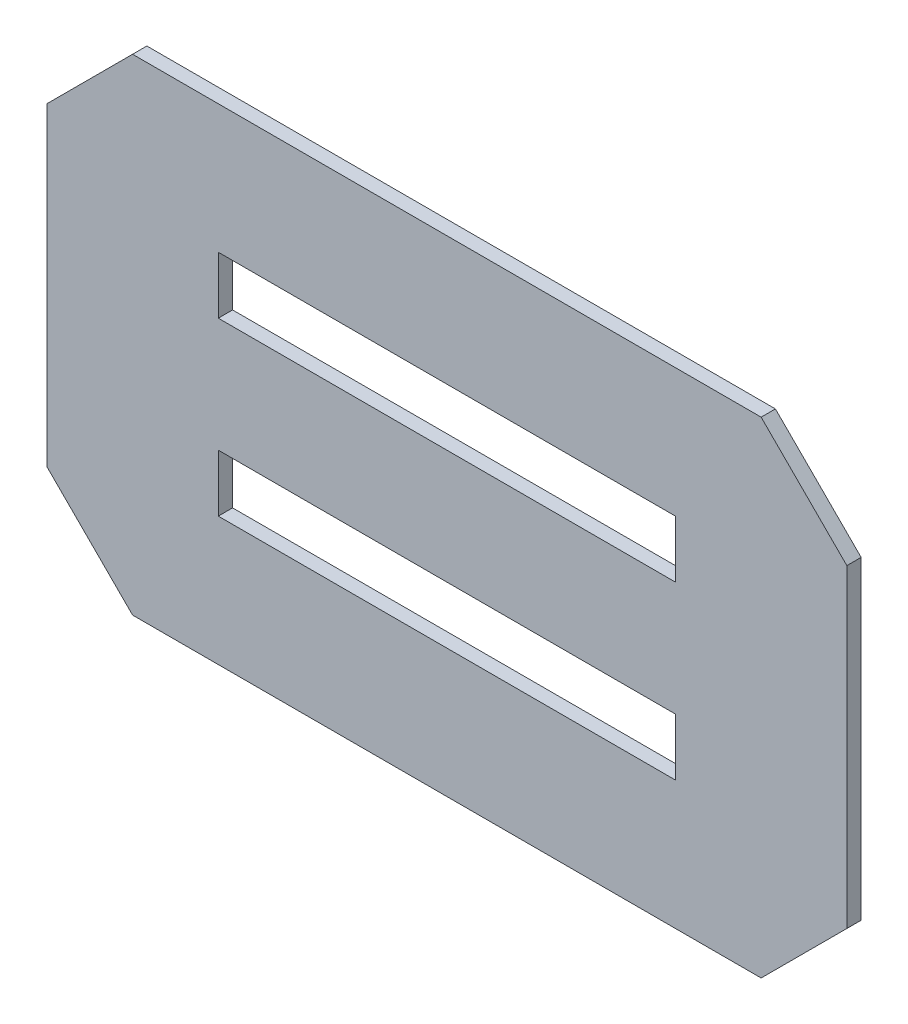
ISO-10303-21;
HEADER;
FILE_DESCRIPTION(('STEP AP214'),'2;1');
FILE_NAME('part.step','',(''),(''),'','','');
FILE_SCHEMA(('AUTOMOTIVE_DESIGN { 1 0 10303 214 1 1 1 1 }'));
ENDSEC;
DATA;
#1=APPLICATION_CONTEXT('core data for automotive mechanical design processes');
#2=APPLICATION_PROTOCOL_DEFINITION('international standard','automotive_design',2000,#1);
#3=PRODUCT_CONTEXT('',#1,'mechanical');
#4=PRODUCT('Part','Part','',(#3));
#5=PRODUCT_RELATED_PRODUCT_CATEGORY('part','',(#4));
#6=PRODUCT_DEFINITION_FORMATION('','',#4);
#7=PRODUCT_DEFINITION_CONTEXT('part definition',#1,'design');
#8=PRODUCT_DEFINITION('design','',#6,#7);
#9=PRODUCT_DEFINITION_SHAPE('','',#8);
#10=(LENGTH_UNIT() NAMED_UNIT(*) SI_UNIT(.MILLI.,.METRE.));
#11=(NAMED_UNIT(*) PLANE_ANGLE_UNIT() SI_UNIT($,.RADIAN.));
#12=(NAMED_UNIT(*) SI_UNIT($,.STERADIAN.) SOLID_ANGLE_UNIT());
#13=UNCERTAINTY_MEASURE_WITH_UNIT(LENGTH_MEASURE(1.E-05),#10,'distance_accuracy_value','');
#14=(GEOMETRIC_REPRESENTATION_CONTEXT(3) GLOBAL_UNCERTAINTY_ASSIGNED_CONTEXT((#13)) GLOBAL_UNIT_ASSIGNED_CONTEXT((#10,
#11,#12)) REPRESENTATION_CONTEXT('',''));
#15=CARTESIAN_POINT('',(0.,0.,0.));
#16=DIRECTION('',(0.,0.,1.));
#17=DIRECTION('',(1.,0.,0.));
#18=AXIS2_PLACEMENT_3D('',#15,#16,#17);
#19=CARTESIAN_POINT('',(0.,0.,0.5));
#20=DIRECTION('',(0.,0.,-1.));
#21=DIRECTION('',(-1.,0.,0.));
#22=AXIS2_PLACEMENT_3D('',#19,#20,#21);
#23=PLANE('',#22);
#24=DIRECTION('',(0.,-1.,0.));
#25=VECTOR('',#24,1.);
#26=CARTESIAN_POINT('',(-8.,-4.,0.5));
#27=LINE('',#26,#25);
#28=CARTESIAN_POINT('',(-8.,-2.,0.5));
#29=VERTEX_POINT('',#28);
#30=CARTESIAN_POINT('',(-8.,-4.,0.5));
#31=VERTEX_POINT('',#30);
#32=EDGE_CURVE('E190',#29,#31,#27,.T.);
#33=ORIENTED_EDGE('',*,*,#32,.F.);
#34=DIRECTION('',(-1.,0.,0.));
#35=VECTOR('',#34,1.);
#36=CARTESIAN_POINT('',(-8.,-2.,0.5));
#37=LINE('',#36,#35);
#38=CARTESIAN_POINT('',(8.,-2.,0.5));
#39=VERTEX_POINT('',#38);
#40=EDGE_CURVE('E198',#39,#29,#37,.T.);
#41=ORIENTED_EDGE('',*,*,#40,.F.);
#42=DIRECTION('',(0.,1.,0.));
#43=VECTOR('',#42,1.);
#44=CARTESIAN_POINT('',(8.,-4.,0.5));
#45=LINE('',#44,#43);
#46=CARTESIAN_POINT('',(8.,-4.,0.5));
#47=VERTEX_POINT('',#46);
#48=EDGE_CURVE('E195',#47,#39,#45,.T.);
#49=ORIENTED_EDGE('',*,*,#48,.F.);
#50=DIRECTION('',(1.,0.,0.));
#51=VECTOR('',#50,1.);
#52=CARTESIAN_POINT('',(-8.,-4.,0.5));
#53=LINE('',#52,#51);
#54=EDGE_CURVE('E192',#31,#47,#53,.T.);
#55=ORIENTED_EDGE('',*,*,#54,.F.);
#56=EDGE_LOOP('',(#33,#41,#49,#55));
#57=FACE_BOUND('',#56,.T.);
#58=DIRECTION('',(-1.,0.,0.));
#59=VECTOR('',#58,1.);
#60=CARTESIAN_POINT('',(-11.,8.5,0.5));
#61=LINE('',#60,#59);
#62=CARTESIAN_POINT('',(11.,8.5,0.5));
#63=VERTEX_POINT('',#62);
#64=CARTESIAN_POINT('',(-11.,8.5,0.5));
#65=VERTEX_POINT('',#64);
#66=EDGE_CURVE('E221',#63,#65,#61,.T.);
#67=ORIENTED_EDGE('',*,*,#66,.T.);
#68=DIRECTION('',(-0.707106781186548,-0.707106781186547,0.));
#69=VECTOR('',#68,1.);
#70=CARTESIAN_POINT('',(-14.,5.5,0.5));
#71=LINE('',#70,#69);
#72=CARTESIAN_POINT('',(-14.,5.5,0.5));
#73=VERTEX_POINT('',#72);
#74=EDGE_CURVE('E224',#65,#73,#71,.T.);
#75=ORIENTED_EDGE('',*,*,#74,.T.);
#76=DIRECTION('',(0.,-1.,0.));
#77=VECTOR('',#76,1.);
#78=CARTESIAN_POINT('',(-14.,5.5,0.5));
#79=LINE('',#78,#77);
#80=CARTESIAN_POINT('',(-14.,-5.5,0.5));
#81=VERTEX_POINT('',#80);
#82=EDGE_CURVE('E227',#73,#81,#79,.T.);
#83=ORIENTED_EDGE('',*,*,#82,.T.);
#84=DIRECTION('',(0.707106781186547,-0.707106781186548,0.));
#85=VECTOR('',#84,1.);
#86=CARTESIAN_POINT('',(-14.,-5.5,0.5));
#87=LINE('',#86,#85);
#88=CARTESIAN_POINT('',(-11.,-8.5,0.5));
#89=VERTEX_POINT('',#88);
#90=EDGE_CURVE('E229',#81,#89,#87,.T.);
#91=ORIENTED_EDGE('',*,*,#90,.T.);
#92=DIRECTION('',(1.,0.,0.));
#93=VECTOR('',#92,1.);
#94=CARTESIAN_POINT('',(-11.,-8.5,0.5));
#95=LINE('',#94,#93);
#96=CARTESIAN_POINT('',(11.,-8.5,0.5));
#97=VERTEX_POINT('',#96);
#98=EDGE_CURVE('E231',#89,#97,#95,.T.);
#99=ORIENTED_EDGE('',*,*,#98,.T.);
#100=DIRECTION('',(0.707106781186548,0.707106781186547,0.));
#101=VECTOR('',#100,1.);
#102=CARTESIAN_POINT('',(11.,-8.5,0.5));
#103=LINE('',#102,#101);
#104=CARTESIAN_POINT('',(14.,-5.5,0.5));
#105=VERTEX_POINT('',#104);
#106=EDGE_CURVE('E233',#97,#105,#103,.T.);
#107=ORIENTED_EDGE('',*,*,#106,.T.);
#108=DIRECTION('',(0.,1.,0.));
#109=VECTOR('',#108,1.);
#110=CARTESIAN_POINT('',(14.,5.5,0.5));
#111=LINE('',#110,#109);
#112=CARTESIAN_POINT('',(14.,5.5,0.5));
#113=VERTEX_POINT('',#112);
#114=EDGE_CURVE('E235',#105,#113,#111,.T.);
#115=ORIENTED_EDGE('',*,*,#114,.T.);
#116=DIRECTION('',(-0.707106781186548,0.707106781186547,0.));
#117=VECTOR('',#116,1.);
#118=CARTESIAN_POINT('',(11.,8.5,0.5));
#119=LINE('',#118,#117);
#120=EDGE_CURVE('E237',#113,#63,#119,.T.);
#121=ORIENTED_EDGE('',*,*,#120,.T.);
#122=EDGE_LOOP('',(#67,#75,#83,#91,#99,#107,#115,#121));
#123=FACE_BOUND('',#122,.T.);
#124=DIRECTION('',(0.,1.,0.));
#125=VECTOR('',#124,1.);
#126=CARTESIAN_POINT('',(8.,4.,0.5));
#127=LINE('',#126,#125);
#128=CARTESIAN_POINT('',(8.,2.,0.5));
#129=VERTEX_POINT('',#128);
#130=CARTESIAN_POINT('',(8.,4.,0.5));
#131=VERTEX_POINT('',#130);
#132=EDGE_CURVE('E154',#129,#131,#127,.T.);
#133=ORIENTED_EDGE('',*,*,#132,.F.);
#134=DIRECTION('',(1.,0.,0.));
#135=VECTOR('',#134,1.);
#136=CARTESIAN_POINT('',(-8.,2.,0.5));
#137=LINE('',#136,#135);
#138=CARTESIAN_POINT('',(-8.,2.,0.5));
#139=VERTEX_POINT('',#138);
#140=EDGE_CURVE('E176',#139,#129,#137,.T.);
#141=ORIENTED_EDGE('',*,*,#140,.F.);
#142=DIRECTION('',(0.,-1.,0.));
#143=VECTOR('',#142,1.);
#144=CARTESIAN_POINT('',(-8.,4.,0.5));
#145=LINE('',#144,#143);
#146=CARTESIAN_POINT('',(-8.,4.,0.5));
#147=VERTEX_POINT('',#146);
#148=EDGE_CURVE('E174',#147,#139,#145,.T.);
#149=ORIENTED_EDGE('',*,*,#148,.F.);
#150=DIRECTION('',(-1.,0.,0.));
#151=VECTOR('',#150,1.);
#152=CARTESIAN_POINT('',(-8.,4.,0.5));
#153=LINE('',#152,#151);
#154=EDGE_CURVE('E162',#131,#147,#153,.T.);
#155=ORIENTED_EDGE('',*,*,#154,.F.);
#156=EDGE_LOOP('',(#133,#141,#149,#155));
#157=FACE_BOUND('',#156,.T.);
#158=ADVANCED_FACE('F41',(#57,#123,#157),#23,.F.);
#159=CARTESIAN_POINT('',(0.,0.,0.));
#160=DIRECTION('',(0.,0.,-1.));
#161=DIRECTION('',(-1.,0.,0.));
#162=AXIS2_PLACEMENT_3D('',#159,#160,#161);
#163=PLANE('',#162);
#164=DIRECTION('',(-1.,0.,0.));
#165=VECTOR('',#164,1.);
#166=CARTESIAN_POINT('',(-11.,8.5,0.));
#167=LINE('',#166,#165);
#168=CARTESIAN_POINT('',(11.,8.5,0.));
#169=VERTEX_POINT('',#168);
#170=CARTESIAN_POINT('',(-11.,8.5,0.));
#171=VERTEX_POINT('',#170);
#172=EDGE_CURVE('E220',#169,#171,#167,.T.);
#173=ORIENTED_EDGE('',*,*,#172,.F.);
#174=DIRECTION('',(-0.707106781186548,0.707106781186547,0.));
#175=VECTOR('',#174,1.);
#176=CARTESIAN_POINT('',(11.,8.5,0.));
#177=LINE('',#176,#175);
#178=CARTESIAN_POINT('',(14.,5.5,0.));
#179=VERTEX_POINT('',#178);
#180=EDGE_CURVE('E225',#179,#169,#177,.T.);
#181=ORIENTED_EDGE('',*,*,#180,.F.);
#182=DIRECTION('',(0.,1.,0.));
#183=VECTOR('',#182,1.);
#184=CARTESIAN_POINT('',(14.,5.5,0.));
#185=LINE('',#184,#183);
#186=CARTESIAN_POINT('',(14.,-5.5,0.));
#187=VERTEX_POINT('',#186);
#188=EDGE_CURVE('E252',#187,#179,#185,.T.);
#189=ORIENTED_EDGE('',*,*,#188,.F.);
#190=DIRECTION('',(0.707106781186548,0.707106781186547,0.));
#191=VECTOR('',#190,1.);
#192=CARTESIAN_POINT('',(11.,-8.5,0.));
#193=LINE('',#192,#191);
#194=CARTESIAN_POINT('',(11.,-8.5,0.));
#195=VERTEX_POINT('',#194);
#196=EDGE_CURVE('E250',#195,#187,#193,.T.);
#197=ORIENTED_EDGE('',*,*,#196,.F.);
#198=DIRECTION('',(1.,0.,0.));
#199=VECTOR('',#198,1.);
#200=CARTESIAN_POINT('',(-11.,-8.5,0.));
#201=LINE('',#200,#199);
#202=CARTESIAN_POINT('',(-11.,-8.5,0.));
#203=VERTEX_POINT('',#202);
#204=EDGE_CURVE('E248',#203,#195,#201,.T.);
#205=ORIENTED_EDGE('',*,*,#204,.F.);
#206=DIRECTION('',(0.707106781186547,-0.707106781186548,0.));
#207=VECTOR('',#206,1.);
#208=CARTESIAN_POINT('',(-14.,-5.5,0.));
#209=LINE('',#208,#207);
#210=CARTESIAN_POINT('',(-14.,-5.5,0.));
#211=VERTEX_POINT('',#210);
#212=EDGE_CURVE('E246',#211,#203,#209,.T.);
#213=ORIENTED_EDGE('',*,*,#212,.F.);
#214=DIRECTION('',(0.,-1.,0.));
#215=VECTOR('',#214,1.);
#216=CARTESIAN_POINT('',(-14.,5.5,0.));
#217=LINE('',#216,#215);
#218=CARTESIAN_POINT('',(-14.,5.5,0.));
#219=VERTEX_POINT('',#218);
#220=EDGE_CURVE('E244',#219,#211,#217,.T.);
#221=ORIENTED_EDGE('',*,*,#220,.F.);
#222=DIRECTION('',(-0.707106781186548,-0.707106781186547,0.));
#223=VECTOR('',#222,1.);
#224=CARTESIAN_POINT('',(-14.,5.5,0.));
#225=LINE('',#224,#223);
#226=EDGE_CURVE('E242',#171,#219,#225,.T.);
#227=ORIENTED_EDGE('',*,*,#226,.F.);
#228=EDGE_LOOP('',(#173,#181,#189,#197,#205,#213,#221,#227));
#229=FACE_BOUND('',#228,.T.);
#230=DIRECTION('',(-1.,0.,0.));
#231=VECTOR('',#230,1.);
#232=CARTESIAN_POINT('',(-8.,-2.,0.));
#233=LINE('',#232,#231);
#234=CARTESIAN_POINT('',(8.,-2.,0.));
#235=VERTEX_POINT('',#234);
#236=CARTESIAN_POINT('',(-8.,-2.,0.));
#237=VERTEX_POINT('',#236);
#238=EDGE_CURVE('E193',#235,#237,#233,.T.);
#239=ORIENTED_EDGE('',*,*,#238,.T.);
#240=DIRECTION('',(0.,-1.,0.));
#241=VECTOR('',#240,1.);
#242=CARTESIAN_POINT('',(-8.,-4.,0.));
#243=LINE('',#242,#241);
#244=CARTESIAN_POINT('',(-8.,-4.,0.));
#245=VERTEX_POINT('',#244);
#246=EDGE_CURVE('E170',#237,#245,#243,.T.);
#247=ORIENTED_EDGE('',*,*,#246,.T.);
#248=DIRECTION('',(1.,0.,0.));
#249=VECTOR('',#248,1.);
#250=CARTESIAN_POINT('',(-8.,-4.,0.));
#251=LINE('',#250,#249);
#252=CARTESIAN_POINT('',(8.,-4.,0.));
#253=VERTEX_POINT('',#252);
#254=EDGE_CURVE('E203',#245,#253,#251,.T.);
#255=ORIENTED_EDGE('',*,*,#254,.T.);
#256=DIRECTION('',(0.,1.,0.));
#257=VECTOR('',#256,1.);
#258=CARTESIAN_POINT('',(8.,-4.,0.));
#259=LINE('',#258,#257);
#260=EDGE_CURVE('E206',#253,#235,#259,.T.);
#261=ORIENTED_EDGE('',*,*,#260,.T.);
#262=EDGE_LOOP('',(#239,#247,#255,#261));
#263=FACE_BOUND('',#262,.T.);
#264=DIRECTION('',(1.,0.,0.));
#265=VECTOR('',#264,1.);
#266=CARTESIAN_POINT('',(-8.,2.,0.));
#267=LINE('',#266,#265);
#268=CARTESIAN_POINT('',(-8.,2.,0.));
#269=VERTEX_POINT('',#268);
#270=CARTESIAN_POINT('',(8.,2.,0.));
#271=VERTEX_POINT('',#270);
#272=EDGE_CURVE('E163',#269,#271,#267,.T.);
#273=ORIENTED_EDGE('',*,*,#272,.T.);
#274=DIRECTION('',(0.,1.,0.));
#275=VECTOR('',#274,1.);
#276=CARTESIAN_POINT('',(8.,4.,0.));
#277=LINE('',#276,#275);
#278=CARTESIAN_POINT('',(8.,4.,0.));
#279=VERTEX_POINT('',#278);
#280=EDGE_CURVE('E64',#271,#279,#277,.T.);
#281=ORIENTED_EDGE('',*,*,#280,.T.);
#282=DIRECTION('',(-1.,0.,0.));
#283=VECTOR('',#282,1.);
#284=CARTESIAN_POINT('',(-8.,4.,0.));
#285=LINE('',#284,#283);
#286=CARTESIAN_POINT('',(-8.,4.,0.));
#287=VERTEX_POINT('',#286);
#288=EDGE_CURVE('E169',#279,#287,#285,.T.);
#289=ORIENTED_EDGE('',*,*,#288,.T.);
#290=DIRECTION('',(0.,-1.,0.));
#291=VECTOR('',#290,1.);
#292=CARTESIAN_POINT('',(-8.,4.,0.));
#293=LINE('',#292,#291);
#294=EDGE_CURVE('E182',#287,#269,#293,.T.);
#295=ORIENTED_EDGE('',*,*,#294,.T.);
#296=EDGE_LOOP('',(#273,#281,#289,#295));
#297=FACE_BOUND('',#296,.T.);
#298=ADVANCED_FACE('F282',(#229,#263,#297),#163,.T.);
#299=CARTESIAN_POINT('',(-11.,8.5,0.5));
#300=DIRECTION('',(0.,-1.,0.));
#301=DIRECTION('',(0.,0.,-1.));
#302=AXIS2_PLACEMENT_3D('',#299,#300,#301);
#303=PLANE('',#302);
#304=ORIENTED_EDGE('',*,*,#172,.T.);
#305=DIRECTION('',(0.,0.,-1.));
#306=VECTOR('',#305,1.);
#307=CARTESIAN_POINT('',(-11.,8.5,0.5));
#308=LINE('',#307,#306);
#309=EDGE_CURVE('E11',#65,#171,#308,.T.);
#310=ORIENTED_EDGE('',*,*,#309,.F.);
#311=ORIENTED_EDGE('',*,*,#66,.F.);
#312=DIRECTION('',(0.,0.,-1.));
#313=VECTOR('',#312,1.);
#314=CARTESIAN_POINT('',(11.,8.5,0.5));
#315=LINE('',#314,#313);
#316=EDGE_CURVE('E239',#63,#169,#315,.T.);
#317=ORIENTED_EDGE('',*,*,#316,.T.);
#318=EDGE_LOOP('',(#304,#310,#311,#317));
#319=FACE_BOUND('',#318,.T.);
#320=ADVANCED_FACE('F43',(#319),#303,.F.);
#321=CARTESIAN_POINT('',(-14.,5.5,0.5));
#322=DIRECTION('',(0.707106781186547,-0.707106781186548,0.));
#323=DIRECTION('',(0.707106781186548,0.707106781186547,0.));
#324=AXIS2_PLACEMENT_3D('',#321,#322,#323);
#325=PLANE('',#324);
#326=ORIENTED_EDGE('',*,*,#226,.T.);
#327=DIRECTION('',(0.,0.,-1.));
#328=VECTOR('',#327,1.);
#329=CARTESIAN_POINT('',(-14.,5.5,0.5));
#330=LINE('',#329,#328);
#331=EDGE_CURVE('E49',#73,#219,#330,.T.);
#332=ORIENTED_EDGE('',*,*,#331,.F.);
#333=ORIENTED_EDGE('',*,*,#74,.F.);
#334=ORIENTED_EDGE('',*,*,#309,.T.);
#335=EDGE_LOOP('',(#326,#332,#333,#334));
#336=FACE_BOUND('',#335,.T.);
#337=ADVANCED_FACE('F299',(#336),#325,.F.);
#338=CARTESIAN_POINT('',(-14.,5.5,0.5));
#339=DIRECTION('',(1.,0.,0.));
#340=DIRECTION('',(0.,1.,0.));
#341=AXIS2_PLACEMENT_3D('',#338,#339,#340);
#342=PLANE('',#341);
#343=ORIENTED_EDGE('',*,*,#220,.T.);
#344=DIRECTION('',(0.,0.,-1.));
#345=VECTOR('',#344,1.);
#346=CARTESIAN_POINT('',(-14.,-5.5,0.5));
#347=LINE('',#346,#345);
#348=EDGE_CURVE('E269',#81,#211,#347,.T.);
#349=ORIENTED_EDGE('',*,*,#348,.F.);
#350=ORIENTED_EDGE('',*,*,#82,.F.);
#351=ORIENTED_EDGE('',*,*,#331,.T.);
#352=EDGE_LOOP('',(#343,#349,#350,#351));
#353=FACE_BOUND('',#352,.T.);
#354=ADVANCED_FACE('F276',(#353),#342,.F.);
#355=CARTESIAN_POINT('',(-14.,-5.5,0.5));
#356=DIRECTION('',(0.707106781186548,0.707106781186547,0.));
#357=DIRECTION('',(-0.707106781186547,0.707106781186548,0.));
#358=AXIS2_PLACEMENT_3D('',#355,#356,#357);
#359=PLANE('',#358);
#360=ORIENTED_EDGE('',*,*,#212,.T.);
#361=DIRECTION('',(0.,0.,-1.));
#362=VECTOR('',#361,1.);
#363=CARTESIAN_POINT('',(-11.,-8.5,0.5));
#364=LINE('',#363,#362);
#365=EDGE_CURVE('E266',#89,#203,#364,.T.);
#366=ORIENTED_EDGE('',*,*,#365,.F.);
#367=ORIENTED_EDGE('',*,*,#90,.F.);
#368=ORIENTED_EDGE('',*,*,#348,.T.);
#369=EDGE_LOOP('',(#360,#366,#367,#368));
#370=FACE_BOUND('',#369,.T.);
#371=ADVANCED_FACE('F288',(#370),#359,.F.);
#372=CARTESIAN_POINT('',(-11.,-8.5,0.5));
#373=DIRECTION('',(0.,1.,0.));
#374=DIRECTION('',(0.,0.,1.));
#375=AXIS2_PLACEMENT_3D('',#372,#373,#374);
#376=PLANE('',#375);
#377=ORIENTED_EDGE('',*,*,#204,.T.);
#378=DIRECTION('',(0.,0.,-1.));
#379=VECTOR('',#378,1.);
#380=CARTESIAN_POINT('',(11.,-8.5,0.5));
#381=LINE('',#380,#379);
#382=EDGE_CURVE('E263',#97,#195,#381,.T.);
#383=ORIENTED_EDGE('',*,*,#382,.F.);
#384=ORIENTED_EDGE('',*,*,#98,.F.);
#385=ORIENTED_EDGE('',*,*,#365,.T.);
#386=EDGE_LOOP('',(#377,#383,#384,#385));
#387=FACE_BOUND('',#386,.T.);
#388=ADVANCED_FACE('F292',(#387),#376,.F.);
#389=CARTESIAN_POINT('',(11.,-8.5,0.5));
#390=DIRECTION('',(-0.707106781186547,0.707106781186548,0.));
#391=DIRECTION('',(-0.707106781186548,-0.707106781186547,0.));
#392=AXIS2_PLACEMENT_3D('',#389,#390,#391);
#393=PLANE('',#392);
#394=ORIENTED_EDGE('',*,*,#196,.T.);
#395=DIRECTION('',(0.,0.,-1.));
#396=VECTOR('',#395,1.);
#397=CARTESIAN_POINT('',(14.,-5.5,0.5));
#398=LINE('',#397,#396);
#399=EDGE_CURVE('E260',#105,#187,#398,.T.);
#400=ORIENTED_EDGE('',*,*,#399,.F.);
#401=ORIENTED_EDGE('',*,*,#106,.F.);
#402=ORIENTED_EDGE('',*,*,#382,.T.);
#403=EDGE_LOOP('',(#394,#400,#401,#402));
#404=FACE_BOUND('',#403,.T.);
#405=ADVANCED_FACE('F312',(#404),#393,.F.);
#406=CARTESIAN_POINT('',(14.,5.5,0.5));
#407=DIRECTION('',(-1.,0.,0.));
#408=DIRECTION('',(0.,-1.,0.));
#409=AXIS2_PLACEMENT_3D('',#406,#407,#408);
#410=PLANE('',#409);
#411=ORIENTED_EDGE('',*,*,#188,.T.);
#412=DIRECTION('',(0.,0.,-1.));
#413=VECTOR('',#412,1.);
#414=CARTESIAN_POINT('',(14.,5.5,0.5));
#415=LINE('',#414,#413);
#416=EDGE_CURVE('E257',#113,#179,#415,.T.);
#417=ORIENTED_EDGE('',*,*,#416,.F.);
#418=ORIENTED_EDGE('',*,*,#114,.F.);
#419=ORIENTED_EDGE('',*,*,#399,.T.);
#420=EDGE_LOOP('',(#411,#417,#418,#419));
#421=FACE_BOUND('',#420,.T.);
#422=ADVANCED_FACE('F310',(#421),#410,.F.);
#423=CARTESIAN_POINT('',(11.,8.5,0.5));
#424=DIRECTION('',(-0.707106781186547,-0.707106781186548,0.));
#425=DIRECTION('',(0.707106781186548,-0.707106781186547,0.));
#426=AXIS2_PLACEMENT_3D('',#423,#424,#425);
#427=PLANE('',#426);
#428=ORIENTED_EDGE('',*,*,#180,.T.);
#429=ORIENTED_EDGE('',*,*,#316,.F.);
#430=ORIENTED_EDGE('',*,*,#120,.F.);
#431=ORIENTED_EDGE('',*,*,#416,.T.);
#432=EDGE_LOOP('',(#428,#429,#430,#431));
#433=FACE_BOUND('',#432,.T.);
#434=ADVANCED_FACE('F305',(#433),#427,.F.);
#435=CARTESIAN_POINT('',(-8.,-4.,0.5));
#436=DIRECTION('',(1.,0.,0.));
#437=DIRECTION('',(0.,0.,-1.));
#438=AXIS2_PLACEMENT_3D('',#435,#436,#437);
#439=PLANE('',#438);
#440=ORIENTED_EDGE('',*,*,#246,.F.);
#441=DIRECTION('',(0.,0.,-1.));
#442=VECTOR('',#441,1.);
#443=CARTESIAN_POINT('',(-8.,-2.,0.5));
#444=LINE('',#443,#442);
#445=EDGE_CURVE('E200',#29,#237,#444,.T.);
#446=ORIENTED_EDGE('',*,*,#445,.F.);
#447=ORIENTED_EDGE('',*,*,#32,.T.);
#448=DIRECTION('',(0.,0.,-1.));
#449=VECTOR('',#448,1.);
#450=CARTESIAN_POINT('',(-8.,-4.,0.5));
#451=LINE('',#450,#449);
#452=EDGE_CURVE('E217',#31,#245,#451,.T.);
#453=ORIENTED_EDGE('',*,*,#452,.T.);
#454=EDGE_LOOP('',(#440,#446,#447,#453));
#455=FACE_BOUND('',#454,.T.);
#456=ADVANCED_FACE('F330',(#455),#439,.T.);
#457=CARTESIAN_POINT('',(-8.,-4.,0.5));
#458=DIRECTION('',(0.,1.,0.));
#459=DIRECTION('',(0.,0.,1.));
#460=AXIS2_PLACEMENT_3D('',#457,#458,#459);
#461=PLANE('',#460);
#462=ORIENTED_EDGE('',*,*,#254,.F.);
#463=ORIENTED_EDGE('',*,*,#452,.F.);
#464=ORIENTED_EDGE('',*,*,#54,.T.);
#465=DIRECTION('',(0.,0.,-1.));
#466=VECTOR('',#465,1.);
#467=CARTESIAN_POINT('',(8.,-4.,0.5));
#468=LINE('',#467,#466);
#469=EDGE_CURVE('E215',#47,#253,#468,.T.);
#470=ORIENTED_EDGE('',*,*,#469,.T.);
#471=EDGE_LOOP('',(#462,#463,#464,#470));
#472=FACE_BOUND('',#471,.T.);
#473=ADVANCED_FACE('F337',(#472),#461,.T.);
#474=CARTESIAN_POINT('',(8.,-4.,0.5));
#475=DIRECTION('',(-1.,0.,0.));
#476=DIRECTION('',(0.,0.,1.));
#477=AXIS2_PLACEMENT_3D('',#474,#475,#476);
#478=PLANE('',#477);
#479=ORIENTED_EDGE('',*,*,#260,.F.);
#480=ORIENTED_EDGE('',*,*,#469,.F.);
#481=ORIENTED_EDGE('',*,*,#48,.T.);
#482=DIRECTION('',(0.,0.,-1.));
#483=VECTOR('',#482,1.);
#484=CARTESIAN_POINT('',(8.,-2.,0.5));
#485=LINE('',#484,#483);
#486=EDGE_CURVE('E213',#39,#235,#485,.T.);
#487=ORIENTED_EDGE('',*,*,#486,.T.);
#488=EDGE_LOOP('',(#479,#480,#481,#487));
#489=FACE_BOUND('',#488,.T.);
#490=ADVANCED_FACE('F342',(#489),#478,.T.);
#491=CARTESIAN_POINT('',(-8.,-2.,0.5));
#492=DIRECTION('',(0.,-1.,0.));
#493=DIRECTION('',(1.,0.,0.));
#494=AXIS2_PLACEMENT_3D('',#491,#492,#493);
#495=PLANE('',#494);
#496=ORIENTED_EDGE('',*,*,#238,.F.);
#497=ORIENTED_EDGE('',*,*,#486,.F.);
#498=ORIENTED_EDGE('',*,*,#40,.T.);
#499=ORIENTED_EDGE('',*,*,#445,.T.);
#500=EDGE_LOOP('',(#496,#497,#498,#499));
#501=FACE_BOUND('',#500,.T.);
#502=ADVANCED_FACE('F348',(#501),#495,.T.);
#503=CARTESIAN_POINT('',(8.,4.,0.5));
#504=DIRECTION('',(-1.,0.,0.));
#505=DIRECTION('',(0.,0.,1.));
#506=AXIS2_PLACEMENT_3D('',#503,#504,#505);
#507=PLANE('',#506);
#508=ORIENTED_EDGE('',*,*,#280,.F.);
#509=DIRECTION('',(0.,0.,-1.));
#510=VECTOR('',#509,1.);
#511=CARTESIAN_POINT('',(8.,2.,0.5));
#512=LINE('',#511,#510);
#513=EDGE_CURVE('E158',#129,#271,#512,.T.);
#514=ORIENTED_EDGE('',*,*,#513,.F.);
#515=ORIENTED_EDGE('',*,*,#132,.T.);
#516=DIRECTION('',(0.,0.,-1.));
#517=VECTOR('',#516,1.);
#518=CARTESIAN_POINT('',(8.,4.,0.5));
#519=LINE('',#518,#517);
#520=EDGE_CURVE('E157',#131,#279,#519,.T.);
#521=ORIENTED_EDGE('',*,*,#520,.T.);
#522=EDGE_LOOP('',(#508,#514,#515,#521));
#523=FACE_BOUND('',#522,.T.);
#524=ADVANCED_FACE('F156',(#523),#507,.T.);
#525=CARTESIAN_POINT('',(-8.,4.,0.5));
#526=DIRECTION('',(0.,-1.,0.));
#527=DIRECTION('',(0.,0.,-1.));
#528=AXIS2_PLACEMENT_3D('',#525,#526,#527);
#529=PLANE('',#528);
#530=ORIENTED_EDGE('',*,*,#288,.F.);
#531=ORIENTED_EDGE('',*,*,#520,.F.);
#532=ORIENTED_EDGE('',*,*,#154,.T.);
#533=DIRECTION('',(0.,0.,-1.));
#534=VECTOR('',#533,1.);
#535=CARTESIAN_POINT('',(-8.,4.,0.5));
#536=LINE('',#535,#534);
#537=EDGE_CURVE('E171',#147,#287,#536,.T.);
#538=ORIENTED_EDGE('',*,*,#537,.T.);
#539=EDGE_LOOP('',(#530,#531,#532,#538));
#540=FACE_BOUND('',#539,.T.);
#541=ADVANCED_FACE('F166',(#540),#529,.T.);
#542=CARTESIAN_POINT('',(-8.,4.,0.5));
#543=DIRECTION('',(1.,0.,0.));
#544=DIRECTION('',(0.,0.,-1.));
#545=AXIS2_PLACEMENT_3D('',#542,#543,#544);
#546=PLANE('',#545);
#547=ORIENTED_EDGE('',*,*,#294,.F.);
#548=ORIENTED_EDGE('',*,*,#537,.F.);
#549=ORIENTED_EDGE('',*,*,#148,.T.);
#550=DIRECTION('',(0.,0.,-1.));
#551=VECTOR('',#550,1.);
#552=CARTESIAN_POINT('',(-8.,2.,0.5));
#553=LINE('',#552,#551);
#554=EDGE_CURVE('E56',#139,#269,#553,.T.);
#555=ORIENTED_EDGE('',*,*,#554,.T.);
#556=EDGE_LOOP('',(#547,#548,#549,#555));
#557=FACE_BOUND('',#556,.T.);
#558=ADVANCED_FACE('F367',(#557),#546,.T.);
#559=CARTESIAN_POINT('',(-8.,2.,0.5));
#560=DIRECTION('',(0.,1.,0.));
#561=DIRECTION('',(-1.,0.,0.));
#562=AXIS2_PLACEMENT_3D('',#559,#560,#561);
#563=PLANE('',#562);
#564=ORIENTED_EDGE('',*,*,#272,.F.);
#565=ORIENTED_EDGE('',*,*,#554,.F.);
#566=ORIENTED_EDGE('',*,*,#140,.T.);
#567=ORIENTED_EDGE('',*,*,#513,.T.);
#568=EDGE_LOOP('',(#564,#565,#566,#567));
#569=FACE_BOUND('',#568,.T.);
#570=ADVANCED_FACE('F370',(#569),#563,.T.);
#571=CLOSED_SHELL('',(#158,#298,#320,#337,#354,#371,#388,#405,#422,#434,#456,#473,#490,#502,
#524,#541,#558,#570));
#572=MANIFOLD_SOLID_BREP('B2',#571);
#573=ADVANCED_BREP_SHAPE_REPRESENTATION('',(#18,#572),#14);
#574=SHAPE_DEFINITION_REPRESENTATION(#9,#573);
ENDSEC;
END-ISO-10303-21;
